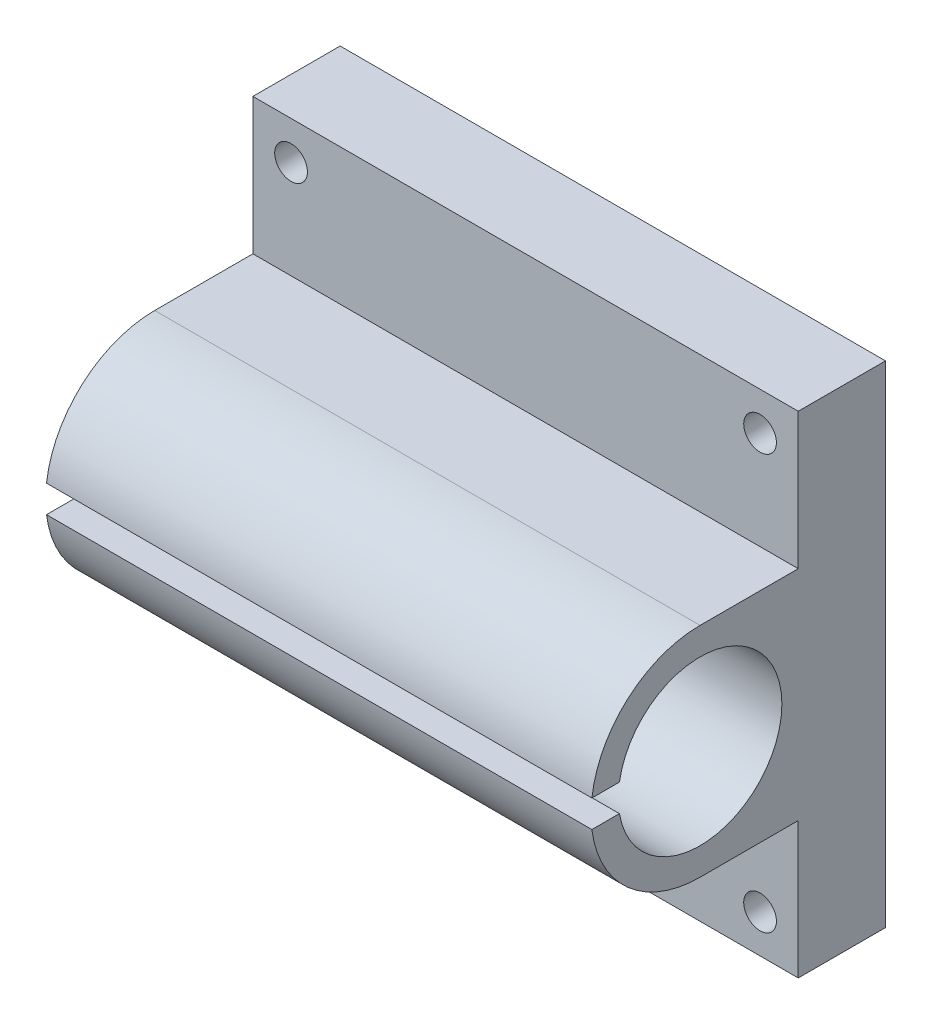
ISO-10303-21;
HEADER;
FILE_DESCRIPTION(('STEP AP214'),'2;1');
FILE_NAME('part.step','',(''),(''),'','','');
FILE_SCHEMA(('AUTOMOTIVE_DESIGN { 1 0 10303 214 1 1 1 1 }'));
ENDSEC;
DATA;
#1=APPLICATION_CONTEXT('core data for automotive mechanical design processes');
#2=APPLICATION_PROTOCOL_DEFINITION('international standard','automotive_design',2000,#1);
#3=PRODUCT_CONTEXT('',#1,'mechanical');
#4=PRODUCT('Part','Part','',(#3));
#5=PRODUCT_RELATED_PRODUCT_CATEGORY('part','',(#4));
#6=PRODUCT_DEFINITION_FORMATION('','',#4);
#7=PRODUCT_DEFINITION_CONTEXT('part definition',#1,'design');
#8=PRODUCT_DEFINITION('design','',#6,#7);
#9=PRODUCT_DEFINITION_SHAPE('','',#8);
#10=(LENGTH_UNIT() NAMED_UNIT(*) SI_UNIT(.MILLI.,.METRE.));
#11=(NAMED_UNIT(*) PLANE_ANGLE_UNIT() SI_UNIT($,.RADIAN.));
#12=(NAMED_UNIT(*) SI_UNIT($,.STERADIAN.) SOLID_ANGLE_UNIT());
#13=UNCERTAINTY_MEASURE_WITH_UNIT(LENGTH_MEASURE(1.E-05),#10,'distance_accuracy_value','');
#14=(GEOMETRIC_REPRESENTATION_CONTEXT(3) GLOBAL_UNCERTAINTY_ASSIGNED_CONTEXT((#13)) GLOBAL_UNIT_ASSIGNED_CONTEXT((#10,
#11,#12)) REPRESENTATION_CONTEXT('',''));
#15=CARTESIAN_POINT('',(0.,0.,0.));
#16=DIRECTION('',(0.,0.,1.));
#17=DIRECTION('',(1.,0.,0.));
#18=AXIS2_PLACEMENT_3D('',#15,#16,#17);
#19=CARTESIAN_POINT('',(-52.5862284482674,0.,17.));
#20=DIRECTION('',(1.,0.,0.));
#21=DIRECTION('',(0.,0.,-1.));
#22=AXIS2_PLACEMENT_3D('',#19,#20,#21);
#23=CYLINDRICAL_SURFACE('',#22,10.);
#24=DIRECTION('',(1.,0.,0.));
#25=VECTOR('',#24,1.);
#26=CARTESIAN_POINT('',(-52.5862284482674,-1.25,26.9215674164922));
#27=LINE('',#26,#25);
#28=CARTESIAN_POINT('',(-25.,-1.25,26.9215674164922));
#29=VERTEX_POINT('',#28);
#30=CARTESIAN_POINT('',(25.,-1.25,26.9215674164922));
#31=VERTEX_POINT('',#30);
#32=EDGE_CURVE('E142',#29,#31,#27,.T.);
#33=ORIENTED_EDGE('',*,*,#32,.F.);
#34=CARTESIAN_POINT('',(-25.,0.,17.));
#35=DIRECTION('',(1.,0.,0.));
#36=DIRECTION('',(0.,0.,-1.));
#37=AXIS2_PLACEMENT_3D('',#34,#35,#36);
#38=CIRCLE('',#37,10.);
#39=CARTESIAN_POINT('',(-25.,-10.,17.));
#40=VERTEX_POINT('',#39);
#41=EDGE_CURVE('E150',#40,#29,#38,.F.);
#42=ORIENTED_EDGE('',*,*,#41,.F.);
#43=DIRECTION('',(1.,0.,0.));
#44=VECTOR('',#43,1.);
#45=CARTESIAN_POINT('',(-52.5862284482674,-10.,17.));
#46=LINE('',#45,#44);
#47=CARTESIAN_POINT('',(25.,-10.,17.));
#48=VERTEX_POINT('',#47);
#49=EDGE_CURVE('E155',#40,#48,#46,.T.);
#50=ORIENTED_EDGE('',*,*,#49,.T.);
#51=CARTESIAN_POINT('',(25.,0.,17.));
#52=DIRECTION('',(1.,0.,0.));
#53=DIRECTION('',(0.,0.,-1.));
#54=AXIS2_PLACEMENT_3D('',#51,#52,#53);
#55=CIRCLE('',#54,10.);
#56=EDGE_CURVE('E144',#31,#48,#55,.T.);
#57=ORIENTED_EDGE('',*,*,#56,.F.);
#58=EDGE_LOOP('',(#33,#42,#50,#57));
#59=FACE_BOUND('',#58,.T.);
#60=ADVANCED_FACE('F34',(#59),#23,.T.);
#61=CARTESIAN_POINT('',(0.,0.,8.));
#62=DIRECTION('',(0.,0.,-1.));
#63=DIRECTION('',(-1.,0.,0.));
#64=AXIS2_PLACEMENT_3D('',#61,#62,#63);
#65=PLANE('',#64);
#66=CARTESIAN_POINT('',(-21.5,-19.,8.));
#67=DIRECTION('',(0.,0.,1.));
#68=DIRECTION('',(-1.,0.,0.));
#69=AXIS2_PLACEMENT_3D('',#66,#67,#68);
#70=CIRCLE('',#69,1.5);
#71=CARTESIAN_POINT('',(-23.,-19.,8.));
#72=VERTEX_POINT('',#71);
#73=EDGE_CURVE('E283',#72,#72,#70,.T.);
#74=ORIENTED_EDGE('',*,*,#73,.F.);
#75=EDGE_LOOP('',(#74));
#76=FACE_BOUND('',#75,.T.);
#77=CARTESIAN_POINT('',(21.5,-19.,8.));
#78=DIRECTION('',(0.,0.,1.));
#79=DIRECTION('',(1.,0.,0.));
#80=AXIS2_PLACEMENT_3D('',#77,#78,#79);
#81=CIRCLE('',#80,1.5);
#82=CARTESIAN_POINT('',(23.,-19.,8.));
#83=VERTEX_POINT('',#82);
#84=EDGE_CURVE('E280',#83,#83,#81,.T.);
#85=ORIENTED_EDGE('',*,*,#84,.F.);
#86=EDGE_LOOP('',(#85));
#87=FACE_BOUND('',#86,.T.);
#88=DIRECTION('',(1.,0.,0.));
#89=VECTOR('',#88,1.);
#90=CARTESIAN_POINT('',(-52.5862284482674,-10.,8.));
#91=LINE('',#90,#89);
#92=CARTESIAN_POINT('',(-25.,-10.,8.));
#93=VERTEX_POINT('',#92);
#94=CARTESIAN_POINT('',(25.,-10.,8.));
#95=VERTEX_POINT('',#94);
#96=EDGE_CURVE('E158',#93,#95,#91,.T.);
#97=ORIENTED_EDGE('',*,*,#96,.F.);
#98=DIRECTION('',(0.,-1.,0.));
#99=VECTOR('',#98,1.);
#100=CARTESIAN_POINT('',(-25.,-22.5,8.));
#101=LINE('',#100,#99);
#102=CARTESIAN_POINT('',(-25.,-22.5,8.));
#103=VERTEX_POINT('',#102);
#104=EDGE_CURVE('E163',#93,#103,#101,.T.);
#105=ORIENTED_EDGE('',*,*,#104,.T.);
#106=DIRECTION('',(1.,0.,0.));
#107=VECTOR('',#106,1.);
#108=CARTESIAN_POINT('',(-25.,-22.5,8.));
#109=LINE('',#108,#107);
#110=CARTESIAN_POINT('',(25.,-22.5,8.));
#111=VERTEX_POINT('',#110);
#112=EDGE_CURVE('E208',#103,#111,#109,.T.);
#113=ORIENTED_EDGE('',*,*,#112,.T.);
#114=DIRECTION('',(0.,1.,0.));
#115=VECTOR('',#114,1.);
#116=CARTESIAN_POINT('',(25.,-22.5,8.));
#117=LINE('',#116,#115);
#118=EDGE_CURVE('E195',#111,#95,#117,.T.);
#119=ORIENTED_EDGE('',*,*,#118,.T.);
#120=EDGE_LOOP('',(#97,#105,#113,#119));
#121=FACE_BOUND('',#120,.T.);
#122=ADVANCED_FACE('F252',(#76,#87,#121),#65,.F.);
#123=CARTESIAN_POINT('',(25.,-22.5,8.));
#124=DIRECTION('',(-1.,0.,0.));
#125=DIRECTION('',(0.,0.,1.));
#126=AXIS2_PLACEMENT_3D('',#123,#124,#125);
#127=PLANE('',#126);
#128=CARTESIAN_POINT('',(25.,0.,17.));
#129=DIRECTION('',(1.,0.,0.));
#130=DIRECTION('',(0.,0.,-1.));
#131=AXIS2_PLACEMENT_3D('',#128,#129,#130);
#132=CIRCLE('',#131,7.5);
#133=CARTESIAN_POINT('',(25.,-1.25,24.3950997288745));
#134=VERTEX_POINT('',#133);
#135=CARTESIAN_POINT('',(25.,1.25,24.3950997288745));
#136=VERTEX_POINT('',#135);
#137=EDGE_CURVE('E134',#134,#136,#132,.T.);
#138=ORIENTED_EDGE('',*,*,#137,.F.);
#139=DIRECTION('',(0.,0.,-1.));
#140=VECTOR('',#139,1.);
#141=CARTESIAN_POINT('',(25.,-1.25,27.5));
#142=LINE('',#141,#140);
#143=EDGE_CURVE('E51',#31,#134,#142,.T.);
#144=ORIENTED_EDGE('',*,*,#143,.F.);
#145=ORIENTED_EDGE('',*,*,#56,.T.);
#146=DIRECTION('',(0.,0.,-1.));
#147=VECTOR('',#146,1.);
#148=CARTESIAN_POINT('',(25.,-10.,8.));
#149=LINE('',#148,#147);
#150=EDGE_CURVE('E152',#48,#95,#149,.T.);
#151=ORIENTED_EDGE('',*,*,#150,.T.);
#152=ORIENTED_EDGE('',*,*,#118,.F.);
#153=DIRECTION('',(0.,0.,-1.));
#154=VECTOR('',#153,1.);
#155=CARTESIAN_POINT('',(25.,-22.5,8.));
#156=LINE('',#155,#154);
#157=CARTESIAN_POINT('',(25.,-22.5,0.));
#158=VERTEX_POINT('',#157);
#159=EDGE_CURVE('E205',#111,#158,#156,.T.);
#160=ORIENTED_EDGE('',*,*,#159,.T.);
#161=DIRECTION('',(0.,1.,0.));
#162=VECTOR('',#161,1.);
#163=CARTESIAN_POINT('',(25.,-22.5,0.));
#164=LINE('',#163,#162);
#165=CARTESIAN_POINT('',(25.,22.5,0.));
#166=VERTEX_POINT('',#165);
#167=EDGE_CURVE('E187',#158,#166,#164,.T.);
#168=ORIENTED_EDGE('',*,*,#167,.T.);
#169=DIRECTION('',(0.,0.,-1.));
#170=VECTOR('',#169,1.);
#171=CARTESIAN_POINT('',(25.,22.5,8.));
#172=LINE('',#171,#170);
#173=CARTESIAN_POINT('',(25.,22.5,8.));
#174=VERTEX_POINT('',#173);
#175=EDGE_CURVE('E129',#174,#166,#172,.T.);
#176=ORIENTED_EDGE('',*,*,#175,.F.);
#177=CARTESIAN_POINT('',(25.,9.99999999999997,8.));
#178=VERTEX_POINT('',#177);
#179=EDGE_CURVE('E193',#178,#174,#117,.T.);
#180=ORIENTED_EDGE('',*,*,#179,.F.);
#181=DIRECTION('',(0.,0.,1.));
#182=VECTOR('',#181,1.);
#183=CARTESIAN_POINT('',(25.,10.,8.));
#184=LINE('',#183,#182);
#185=CARTESIAN_POINT('',(25.,10.,17.));
#186=VERTEX_POINT('',#185);
#187=EDGE_CURVE('E141',#178,#186,#184,.T.);
#188=ORIENTED_EDGE('',*,*,#187,.T.);
#189=CARTESIAN_POINT('',(25.,1.25,26.9215674164922));
#190=VERTEX_POINT('',#189);
#191=EDGE_CURVE('E137',#186,#190,#55,.T.);
#192=ORIENTED_EDGE('',*,*,#191,.T.);
#193=DIRECTION('',(0.,0.,1.));
#194=VECTOR('',#193,1.);
#195=CARTESIAN_POINT('',(25.,1.25,27.5));
#196=LINE('',#195,#194);
#197=EDGE_CURVE('E123',#136,#190,#196,.T.);
#198=ORIENTED_EDGE('',*,*,#197,.F.);
#199=EDGE_LOOP('',(#138,#144,#145,#151,#152,#160,#168,#176,#180,#188,#192,#198));
#200=FACE_BOUND('',#199,.T.);
#201=ADVANCED_FACE('F36',(#200),#127,.F.);
#202=CARTESIAN_POINT('',(-25.,22.5,8.));
#203=DIRECTION('',(0.,-1.,0.));
#204=DIRECTION('',(0.,0.,-1.));
#205=AXIS2_PLACEMENT_3D('',#202,#203,#204);
#206=PLANE('',#205);
#207=DIRECTION('',(-1.,0.,0.));
#208=VECTOR('',#207,1.);
#209=CARTESIAN_POINT('',(-25.,22.5,0.));
#210=LINE('',#209,#208);
#211=CARTESIAN_POINT('',(-25.,22.5,0.));
#212=VERTEX_POINT('',#211);
#213=EDGE_CURVE('E213',#166,#212,#210,.T.);
#214=ORIENTED_EDGE('',*,*,#213,.T.);
#215=DIRECTION('',(0.,0.,-1.));
#216=VECTOR('',#215,1.);
#217=CARTESIAN_POINT('',(-25.,22.5,8.));
#218=LINE('',#217,#216);
#219=CARTESIAN_POINT('',(-25.,22.5,8.));
#220=VERTEX_POINT('',#219);
#221=EDGE_CURVE('E199',#220,#212,#218,.T.);
#222=ORIENTED_EDGE('',*,*,#221,.F.);
#223=DIRECTION('',(-1.,0.,0.));
#224=VECTOR('',#223,1.);
#225=CARTESIAN_POINT('',(-25.,22.5,8.));
#226=LINE('',#225,#224);
#227=EDGE_CURVE('E190',#174,#220,#226,.T.);
#228=ORIENTED_EDGE('',*,*,#227,.F.);
#229=ORIENTED_EDGE('',*,*,#175,.T.);
#230=EDGE_LOOP('',(#214,#222,#228,#229));
#231=FACE_BOUND('',#230,.T.);
#232=ADVANCED_FACE('F231',(#231),#206,.F.);
#233=CARTESIAN_POINT('',(-25.,-22.5,8.));
#234=DIRECTION('',(1.,0.,0.));
#235=DIRECTION('',(0.,0.,-1.));
#236=AXIS2_PLACEMENT_3D('',#233,#234,#235);
#237=PLANE('',#236);
#238=ORIENTED_EDGE('',*,*,#41,.T.);
#239=DIRECTION('',(0.,0.,-1.));
#240=VECTOR('',#239,1.);
#241=CARTESIAN_POINT('',(-25.,-1.25,8.));
#242=LINE('',#241,#240);
#243=CARTESIAN_POINT('',(-25.,-1.25,24.3950997288745));
#244=VERTEX_POINT('',#243);
#245=EDGE_CURVE('E146',#29,#244,#242,.T.);
#246=ORIENTED_EDGE('',*,*,#245,.T.);
#247=CARTESIAN_POINT('',(-25.,0.,17.));
#248=DIRECTION('',(1.,0.,0.));
#249=DIRECTION('',(0.,0.,-1.));
#250=AXIS2_PLACEMENT_3D('',#247,#248,#249);
#251=CIRCLE('',#250,7.5);
#252=CARTESIAN_POINT('',(-25.,1.25,24.3950997288745));
#253=VERTEX_POINT('',#252);
#254=EDGE_CURVE('E178',#253,#244,#251,.F.);
#255=ORIENTED_EDGE('',*,*,#254,.F.);
#256=DIRECTION('',(0.,0.,1.));
#257=VECTOR('',#256,1.);
#258=CARTESIAN_POINT('',(-25.,1.25,8.));
#259=LINE('',#258,#257);
#260=CARTESIAN_POINT('',(-25.,1.25,26.9215674164922));
#261=VERTEX_POINT('',#260);
#262=EDGE_CURVE('E58',#253,#261,#259,.T.);
#263=ORIENTED_EDGE('',*,*,#262,.T.);
#264=CARTESIAN_POINT('',(-25.,10.,17.));
#265=VERTEX_POINT('',#264);
#266=EDGE_CURVE('E162',#261,#265,#38,.F.);
#267=ORIENTED_EDGE('',*,*,#266,.T.);
#268=DIRECTION('',(0.,0.,-1.));
#269=VECTOR('',#268,1.);
#270=CARTESIAN_POINT('',(-25.,10.,8.));
#271=LINE('',#270,#269);
#272=CARTESIAN_POINT('',(-25.,9.99999999999997,8.));
#273=VERTEX_POINT('',#272);
#274=EDGE_CURVE('E173',#265,#273,#271,.T.);
#275=ORIENTED_EDGE('',*,*,#274,.T.);
#276=EDGE_CURVE('E217',#220,#273,#101,.T.);
#277=ORIENTED_EDGE('',*,*,#276,.F.);
#278=ORIENTED_EDGE('',*,*,#221,.T.);
#279=DIRECTION('',(0.,-1.,0.));
#280=VECTOR('',#279,1.);
#281=CARTESIAN_POINT('',(-25.,-22.5,0.));
#282=LINE('',#281,#280);
#283=CARTESIAN_POINT('',(-25.,-22.5,0.));
#284=VERTEX_POINT('',#283);
#285=EDGE_CURVE('E211',#212,#284,#282,.T.);
#286=ORIENTED_EDGE('',*,*,#285,.T.);
#287=DIRECTION('',(0.,0.,-1.));
#288=VECTOR('',#287,1.);
#289=CARTESIAN_POINT('',(-25.,-22.5,8.));
#290=LINE('',#289,#288);
#291=EDGE_CURVE('E202',#103,#284,#290,.T.);
#292=ORIENTED_EDGE('',*,*,#291,.F.);
#293=ORIENTED_EDGE('',*,*,#104,.F.);
#294=DIRECTION('',(0.,0.,1.));
#295=VECTOR('',#294,1.);
#296=CARTESIAN_POINT('',(-25.,-10.,8.));
#297=LINE('',#296,#295);
#298=EDGE_CURVE('E171',#93,#40,#297,.T.);
#299=ORIENTED_EDGE('',*,*,#298,.T.);
#300=EDGE_LOOP('',(#238,#246,#255,#263,#267,#275,#277,#278,#286,#292,#293,#299));
#301=FACE_BOUND('',#300,.T.);
#302=ADVANCED_FACE('F235',(#301),#237,.F.);
#303=CARTESIAN_POINT('',(-25.,-22.5,8.));
#304=DIRECTION('',(0.,1.,0.));
#305=DIRECTION('',(0.,0.,1.));
#306=AXIS2_PLACEMENT_3D('',#303,#304,#305);
#307=PLANE('',#306);
#308=DIRECTION('',(1.,0.,0.));
#309=VECTOR('',#308,1.);
#310=CARTESIAN_POINT('',(-25.,-22.5,0.));
#311=LINE('',#310,#309);
#312=EDGE_CURVE('E209',#284,#158,#311,.T.);
#313=ORIENTED_EDGE('',*,*,#312,.T.);
#314=ORIENTED_EDGE('',*,*,#159,.F.);
#315=ORIENTED_EDGE('',*,*,#112,.F.);
#316=ORIENTED_EDGE('',*,*,#291,.T.);
#317=EDGE_LOOP('',(#313,#314,#315,#316));
#318=FACE_BOUND('',#317,.T.);
#319=ADVANCED_FACE('F251',(#318),#307,.F.);
#320=CARTESIAN_POINT('',(21.5,19.,8.));
#321=DIRECTION('',(0.,0.,1.));
#322=DIRECTION('',(-1.,0.,0.));
#323=AXIS2_PLACEMENT_3D('',#320,#321,#322);
#324=CIRCLE('',#323,1.5);
#325=CARTESIAN_POINT('',(20.,19.,8.));
#326=VERTEX_POINT('',#325);
#327=EDGE_CURVE('E276',#326,#326,#324,.T.);
#328=ORIENTED_EDGE('',*,*,#327,.F.);
#329=EDGE_LOOP('',(#328));
#330=FACE_BOUND('',#329,.T.);
#331=CARTESIAN_POINT('',(-21.5,19.,8.));
#332=DIRECTION('',(0.,0.,1.));
#333=DIRECTION('',(1.,0.,0.));
#334=AXIS2_PLACEMENT_3D('',#331,#332,#333);
#335=CIRCLE('',#334,1.5);
#336=CARTESIAN_POINT('',(-20.,19.,8.));
#337=VERTEX_POINT('',#336);
#338=EDGE_CURVE('E272',#337,#337,#335,.T.);
#339=ORIENTED_EDGE('',*,*,#338,.F.);
#340=EDGE_LOOP('',(#339));
#341=FACE_BOUND('',#340,.T.);
#342=ORIENTED_EDGE('',*,*,#276,.T.);
#343=DIRECTION('',(1.,0.,0.));
#344=VECTOR('',#343,1.);
#345=CARTESIAN_POINT('',(-52.5862284482674,10.,8.));
#346=LINE('',#345,#344);
#347=EDGE_CURVE('E168',#273,#178,#346,.T.);
#348=ORIENTED_EDGE('',*,*,#347,.T.);
#349=ORIENTED_EDGE('',*,*,#179,.T.);
#350=ORIENTED_EDGE('',*,*,#227,.T.);
#351=EDGE_LOOP('',(#342,#348,#349,#350));
#352=FACE_BOUND('',#351,.T.);
#353=ADVANCED_FACE('F227',(#330,#341,#352),#65,.F.);
#354=CARTESIAN_POINT('',(0.,0.,0.));
#355=DIRECTION('',(0.,0.,-1.));
#356=DIRECTION('',(-1.,0.,0.));
#357=AXIS2_PLACEMENT_3D('',#354,#355,#356);
#358=PLANE('',#357);
#359=CARTESIAN_POINT('',(-21.5,-19.,0.));
#360=DIRECTION('',(0.,0.,-1.));
#361=DIRECTION('',(-1.,0.,0.));
#362=AXIS2_PLACEMENT_3D('',#359,#360,#361);
#363=CIRCLE('',#362,1.5);
#364=CARTESIAN_POINT('',(-23.,-19.,0.));
#365=VERTEX_POINT('',#364);
#366=EDGE_CURVE('E38',#365,#365,#363,.T.);
#367=ORIENTED_EDGE('',*,*,#366,.F.);
#368=EDGE_LOOP('',(#367));
#369=FACE_BOUND('',#368,.T.);
#370=CARTESIAN_POINT('',(21.5,-19.,0.));
#371=DIRECTION('',(0.,0.,-1.));
#372=DIRECTION('',(-1.,0.,0.));
#373=AXIS2_PLACEMENT_3D('',#370,#371,#372);
#374=CIRCLE('',#373,1.5);
#375=CARTESIAN_POINT('',(20.,-19.,0.));
#376=VERTEX_POINT('',#375);
#377=EDGE_CURVE('E279',#376,#376,#374,.T.);
#378=ORIENTED_EDGE('',*,*,#377,.F.);
#379=EDGE_LOOP('',(#378));
#380=FACE_BOUND('',#379,.T.);
#381=CARTESIAN_POINT('',(21.5,19.,0.));
#382=DIRECTION('',(0.,0.,-1.));
#383=DIRECTION('',(-1.,0.,0.));
#384=AXIS2_PLACEMENT_3D('',#381,#382,#383);
#385=CIRCLE('',#384,1.5);
#386=CARTESIAN_POINT('',(20.,19.,0.));
#387=VERTEX_POINT('',#386);
#388=EDGE_CURVE('E275',#387,#387,#385,.T.);
#389=ORIENTED_EDGE('',*,*,#388,.F.);
#390=EDGE_LOOP('',(#389));
#391=FACE_BOUND('',#390,.T.);
#392=CARTESIAN_POINT('',(-21.5,19.,0.));
#393=DIRECTION('',(0.,0.,-1.));
#394=DIRECTION('',(-1.,0.,0.));
#395=AXIS2_PLACEMENT_3D('',#392,#393,#394);
#396=CIRCLE('',#395,1.5);
#397=CARTESIAN_POINT('',(-23.,19.,0.));
#398=VERTEX_POINT('',#397);
#399=EDGE_CURVE('E138',#398,#398,#396,.T.);
#400=ORIENTED_EDGE('',*,*,#399,.F.);
#401=EDGE_LOOP('',(#400));
#402=FACE_BOUND('',#401,.T.);
#403=ORIENTED_EDGE('',*,*,#167,.F.);
#404=ORIENTED_EDGE('',*,*,#312,.F.);
#405=ORIENTED_EDGE('',*,*,#285,.F.);
#406=ORIENTED_EDGE('',*,*,#213,.F.);
#407=EDGE_LOOP('',(#403,#404,#405,#406));
#408=FACE_BOUND('',#407,.T.);
#409=ADVANCED_FACE('F248',(#369,#380,#391,#402,#408),#358,.T.);
#410=CARTESIAN_POINT('',(-52.5862284482674,10.,8.));
#411=DIRECTION('',(0.,1.,0.));
#412=DIRECTION('',(0.,0.,1.));
#413=AXIS2_PLACEMENT_3D('',#410,#411,#412);
#414=PLANE('',#413);
#415=ORIENTED_EDGE('',*,*,#274,.F.);
#416=DIRECTION('',(1.,0.,0.));
#417=VECTOR('',#416,1.);
#418=CARTESIAN_POINT('',(-52.5862284482674,10.,17.));
#419=LINE('',#418,#417);
#420=EDGE_CURVE('E182',#265,#186,#419,.T.);
#421=ORIENTED_EDGE('',*,*,#420,.T.);
#422=ORIENTED_EDGE('',*,*,#187,.F.);
#423=ORIENTED_EDGE('',*,*,#347,.F.);
#424=EDGE_LOOP('',(#415,#421,#422,#423));
#425=FACE_BOUND('',#424,.T.);
#426=ADVANCED_FACE('F242',(#425),#414,.T.);
#427=DIRECTION('',(1.,0.,0.));
#428=VECTOR('',#427,1.);
#429=CARTESIAN_POINT('',(-52.5862284482674,1.25,26.9215674164922));
#430=LINE('',#429,#428);
#431=EDGE_CURVE('E265',#190,#261,#430,.F.);
#432=ORIENTED_EDGE('',*,*,#431,.F.);
#433=ORIENTED_EDGE('',*,*,#191,.F.);
#434=ORIENTED_EDGE('',*,*,#420,.F.);
#435=ORIENTED_EDGE('',*,*,#266,.F.);
#436=EDGE_LOOP('',(#432,#433,#434,#435));
#437=FACE_BOUND('',#436,.T.);
#438=ADVANCED_FACE('F264',(#437),#23,.T.);
#439=CARTESIAN_POINT('',(-52.5862284482674,-10.,8.));
#440=DIRECTION('',(0.,-1.,0.));
#441=DIRECTION('',(0.,0.,-1.));
#442=AXIS2_PLACEMENT_3D('',#439,#440,#441);
#443=PLANE('',#442);
#444=ORIENTED_EDGE('',*,*,#298,.F.);
#445=ORIENTED_EDGE('',*,*,#96,.T.);
#446=ORIENTED_EDGE('',*,*,#150,.F.);
#447=ORIENTED_EDGE('',*,*,#49,.F.);
#448=EDGE_LOOP('',(#444,#445,#446,#447));
#449=FACE_BOUND('',#448,.T.);
#450=ADVANCED_FACE('F256',(#449),#443,.T.);
#451=CARTESIAN_POINT('',(-52.5862284482674,0.,17.));
#452=DIRECTION('',(1.,0.,0.));
#453=DIRECTION('',(0.,0.,-1.));
#454=AXIS2_PLACEMENT_3D('',#451,#452,#453);
#455=CYLINDRICAL_SURFACE('',#454,7.5);
#456=ORIENTED_EDGE('',*,*,#254,.T.);
#457=DIRECTION('',(1.,0.,0.));
#458=VECTOR('',#457,1.);
#459=CARTESIAN_POINT('',(-52.5862284482674,-1.25,24.3950997288745));
#460=LINE('',#459,#458);
#461=EDGE_CURVE('E11',#244,#134,#460,.T.);
#462=ORIENTED_EDGE('',*,*,#461,.T.);
#463=ORIENTED_EDGE('',*,*,#137,.T.);
#464=DIRECTION('',(1.,0.,0.));
#465=VECTOR('',#464,1.);
#466=CARTESIAN_POINT('',(-52.5862284482674,1.25,24.3950997288745));
#467=LINE('',#466,#465);
#468=EDGE_CURVE('E43',#136,#253,#467,.F.);
#469=ORIENTED_EDGE('',*,*,#468,.T.);
#470=EDGE_LOOP('',(#456,#462,#463,#469));
#471=FACE_BOUND('',#470,.T.);
#472=ADVANCED_FACE('F140',(#471),#455,.F.);
#473=CARTESIAN_POINT('',(-33.,1.25,27.5));
#474=DIRECTION('',(0.,1.,0.));
#475=DIRECTION('',(0.,0.,1.));
#476=AXIS2_PLACEMENT_3D('',#473,#474,#475);
#477=PLANE('',#476);
#478=ORIENTED_EDGE('',*,*,#431,.T.);
#479=ORIENTED_EDGE('',*,*,#262,.F.);
#480=ORIENTED_EDGE('',*,*,#468,.F.);
#481=ORIENTED_EDGE('',*,*,#197,.T.);
#482=EDGE_LOOP('',(#478,#479,#480,#481));
#483=FACE_BOUND('',#482,.T.);
#484=ADVANCED_FACE('F122',(#483),#477,.F.);
#485=CARTESIAN_POINT('',(-33.,-1.25,27.5));
#486=DIRECTION('',(0.,-1.,0.));
#487=DIRECTION('',(0.,0.,-1.));
#488=AXIS2_PLACEMENT_3D('',#485,#486,#487);
#489=PLANE('',#488);
#490=ORIENTED_EDGE('',*,*,#32,.T.);
#491=ORIENTED_EDGE('',*,*,#143,.T.);
#492=ORIENTED_EDGE('',*,*,#461,.F.);
#493=ORIENTED_EDGE('',*,*,#245,.F.);
#494=EDGE_LOOP('',(#490,#491,#492,#493));
#495=FACE_BOUND('',#494,.T.);
#496=ADVANCED_FACE('F335',(#495),#489,.F.);
#497=CARTESIAN_POINT('',(-21.5,19.,-2.));
#498=DIRECTION('',(0.,0.,1.));
#499=DIRECTION('',(1.,0.,0.));
#500=AXIS2_PLACEMENT_3D('',#497,#498,#499);
#501=CYLINDRICAL_SURFACE('',#500,1.5);
#502=ORIENTED_EDGE('',*,*,#399,.T.);
#503=EDGE_LOOP('',(#502));
#504=FACE_BOUND('',#503,.T.);
#505=ORIENTED_EDGE('',*,*,#338,.T.);
#506=EDGE_LOOP('',(#505));
#507=FACE_BOUND('',#506,.T.);
#508=ADVANCED_FACE('F333',(#504,#507),#501,.F.);
#509=CARTESIAN_POINT('',(21.5,19.,-2.));
#510=DIRECTION('',(0.,0.,1.));
#511=DIRECTION('',(1.,0.,0.));
#512=AXIS2_PLACEMENT_3D('',#509,#510,#511);
#513=CYLINDRICAL_SURFACE('',#512,1.5);
#514=ORIENTED_EDGE('',*,*,#388,.T.);
#515=EDGE_LOOP('',(#514));
#516=FACE_BOUND('',#515,.T.);
#517=ORIENTED_EDGE('',*,*,#327,.T.);
#518=EDGE_LOOP('',(#517));
#519=FACE_BOUND('',#518,.T.);
#520=ADVANCED_FACE('F310',(#516,#519),#513,.F.);
#521=CARTESIAN_POINT('',(21.5,-19.,-2.));
#522=DIRECTION('',(0.,0.,1.));
#523=DIRECTION('',(1.,0.,0.));
#524=AXIS2_PLACEMENT_3D('',#521,#522,#523);
#525=CYLINDRICAL_SURFACE('',#524,1.5);
#526=ORIENTED_EDGE('',*,*,#377,.T.);
#527=EDGE_LOOP('',(#526));
#528=FACE_BOUND('',#527,.T.);
#529=ORIENTED_EDGE('',*,*,#84,.T.);
#530=EDGE_LOOP('',(#529));
#531=FACE_BOUND('',#530,.T.);
#532=ADVANCED_FACE('F307',(#528,#531),#525,.F.);
#533=CARTESIAN_POINT('',(-21.5,-19.,-2.));
#534=DIRECTION('',(0.,0.,1.));
#535=DIRECTION('',(1.,0.,0.));
#536=AXIS2_PLACEMENT_3D('',#533,#534,#535);
#537=CYLINDRICAL_SURFACE('',#536,1.5);
#538=ORIENTED_EDGE('',*,*,#366,.T.);
#539=EDGE_LOOP('',(#538));
#540=FACE_BOUND('',#539,.T.);
#541=ORIENTED_EDGE('',*,*,#73,.T.);
#542=EDGE_LOOP('',(#541));
#543=FACE_BOUND('',#542,.T.);
#544=ADVANCED_FACE('F290',(#540,#543),#537,.F.);
#545=CLOSED_SHELL('',(#60,#122,#201,#232,#302,#319,#353,#409,#426,#438,#450,#472,#484,#496,#508,
#520,#532,#544));
#546=MANIFOLD_SOLID_BREP('B2',#545);
#547=ADVANCED_BREP_SHAPE_REPRESENTATION('',(#18,#546),#14);
#548=SHAPE_DEFINITION_REPRESENTATION(#9,#547);
ENDSEC;
END-ISO-10303-21;
